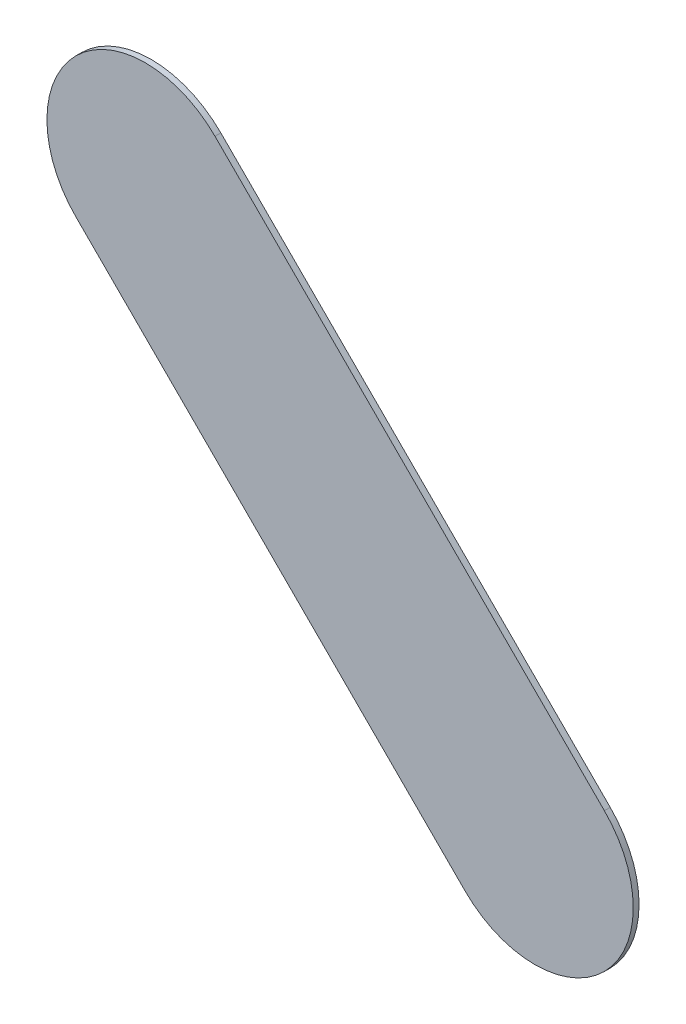
ISO-10303-21;
HEADER;
FILE_DESCRIPTION(('STEP AP214'),'2;1');
FILE_NAME('part.step','',(''),(''),'','','');
FILE_SCHEMA(('AUTOMOTIVE_DESIGN { 1 0 10303 214 1 1 1 1 }'));
ENDSEC;
DATA;
#1=APPLICATION_CONTEXT('core data for automotive mechanical design processes');
#2=APPLICATION_PROTOCOL_DEFINITION('international standard','automotive_design',2000,#1);
#3=PRODUCT_CONTEXT('',#1,'mechanical');
#4=PRODUCT('Part','Part','',(#3));
#5=PRODUCT_RELATED_PRODUCT_CATEGORY('part','',(#4));
#6=PRODUCT_DEFINITION_FORMATION('','',#4);
#7=PRODUCT_DEFINITION_CONTEXT('part definition',#1,'design');
#8=PRODUCT_DEFINITION('design','',#6,#7);
#9=PRODUCT_DEFINITION_SHAPE('','',#8);
#10=(LENGTH_UNIT() NAMED_UNIT(*) SI_UNIT(.MILLI.,.METRE.));
#11=(NAMED_UNIT(*) PLANE_ANGLE_UNIT() SI_UNIT($,.RADIAN.));
#12=(NAMED_UNIT(*) SI_UNIT($,.STERADIAN.) SOLID_ANGLE_UNIT());
#13=UNCERTAINTY_MEASURE_WITH_UNIT(LENGTH_MEASURE(1.E-05),#10,'distance_accuracy_value','');
#14=(GEOMETRIC_REPRESENTATION_CONTEXT(3) GLOBAL_UNCERTAINTY_ASSIGNED_CONTEXT((#13)) GLOBAL_UNIT_ASSIGNED_CONTEXT((#10,
#11,#12)) REPRESENTATION_CONTEXT('',''));
#15=CARTESIAN_POINT('',(0.,0.,0.));
#16=DIRECTION('',(0.,0.,1.));
#17=DIRECTION('',(1.,0.,0.));
#18=AXIS2_PLACEMENT_3D('',#15,#16,#17);
#19=CARTESIAN_POINT('',(49.47576338,120.07572378,0.));
#20=DIRECTION('',(0.707106781186551,0.707106781186544,0.));
#21=DIRECTION('',(0.707106781186544,-0.707106781186551,0.));
#22=AXIS2_PLACEMENT_3D('',#19,#20,#21);
#23=PLANE('',#22);
#24=DIRECTION('',(0.707106781186544,-0.707106781186551,0.));
#25=VECTOR('',#24,1.);
#26=CARTESIAN_POINT('',(49.47576338,120.07572378,0.03556));
#27=LINE('',#26,#25);
#28=CARTESIAN_POINT('',(49.47576338,120.07572378,0.03556));
#29=VERTEX_POINT('',#28);
#30=CARTESIAN_POINT('',(51.84893618,117.70255098,0.03556));
#31=VERTEX_POINT('',#30);
#32=EDGE_CURVE('E11',#29,#31,#27,.T.);
#33=ORIENTED_EDGE('',*,*,#32,.F.);
#34=DIRECTION('',(0.,0.,1.));
#35=VECTOR('',#34,1.);
#36=CARTESIAN_POINT('',(49.47576338,120.07572378,0.));
#37=LINE('',#36,#35);
#38=CARTESIAN_POINT('',(49.47576338,120.07572378,0.));
#39=VERTEX_POINT('',#38);
#40=EDGE_CURVE('E24',#39,#29,#37,.T.);
#41=ORIENTED_EDGE('',*,*,#40,.F.);
#42=DIRECTION('',(0.707106781186544,-0.707106781186551,0.));
#43=VECTOR('',#42,1.);
#44=CARTESIAN_POINT('',(49.47576338,120.07572378,0.));
#45=LINE('',#44,#43);
#46=CARTESIAN_POINT('',(51.84893618,117.70255098,0.));
#47=VERTEX_POINT('',#46);
#48=EDGE_CURVE('E75',#39,#47,#45,.T.);
#49=ORIENTED_EDGE('',*,*,#48,.T.);
#50=DIRECTION('',(0.,0.,1.));
#51=VECTOR('',#50,1.);
#52=CARTESIAN_POINT('',(51.84893618,117.70255098,0.));
#53=LINE('',#52,#51);
#54=EDGE_CURVE('E37',#47,#31,#53,.T.);
#55=ORIENTED_EDGE('',*,*,#54,.T.);
#56=EDGE_LOOP('',(#33,#41,#49,#55));
#57=FACE_BOUND('',#56,.T.);
#58=ADVANCED_FACE('F17',(#57),#23,.F.);
#59=CARTESIAN_POINT('',(52.2732,118.1268148,0.));
#60=DIRECTION('',(0.,0.,-1.));
#61=DIRECTION('',(-0.707106781186542,-0.707106781186554,0.));
#62=AXIS2_PLACEMENT_3D('',#59,#60,#61);
#63=CYLINDRICAL_SURFACE('',#62,0.599999648268223);
#64=CARTESIAN_POINT('',(52.2732,118.1268148,0.03556));
#65=DIRECTION('',(0.,0.,1.));
#66=DIRECTION('',(-0.707106781186542,-0.707106781186554,0.));
#67=AXIS2_PLACEMENT_3D('',#64,#65,#66);
#68=CIRCLE('',#67,0.599999648268223);
#69=CARTESIAN_POINT('',(52.69746382,118.55107862,0.03556));
#70=VERTEX_POINT('',#69);
#71=EDGE_CURVE('E83',#31,#70,#68,.T.);
#72=ORIENTED_EDGE('',*,*,#71,.F.);
#73=ORIENTED_EDGE('',*,*,#54,.F.);
#74=CARTESIAN_POINT('',(52.2732,118.1268148,0.));
#75=DIRECTION('',(0.,0.,1.));
#76=DIRECTION('',(-0.707106781186542,-0.707106781186554,0.));
#77=AXIS2_PLACEMENT_3D('',#74,#75,#76);
#78=CIRCLE('',#77,0.599999648268223);
#79=CARTESIAN_POINT('',(52.69746382,118.55107862,0.));
#80=VERTEX_POINT('',#79);
#81=EDGE_CURVE('E81',#47,#80,#78,.T.);
#82=ORIENTED_EDGE('',*,*,#81,.T.);
#83=DIRECTION('',(0.,0.,1.));
#84=VECTOR('',#83,1.);
#85=CARTESIAN_POINT('',(52.69746382,118.55107862,0.));
#86=LINE('',#85,#84);
#87=EDGE_CURVE('E67',#80,#70,#86,.T.);
#88=ORIENTED_EDGE('',*,*,#87,.T.);
#89=EDGE_LOOP('',(#72,#73,#82,#88));
#90=FACE_BOUND('',#89,.T.);
#91=ADVANCED_FACE('F89',(#90),#63,.T.);
#92=CARTESIAN_POINT('',(52.69746382,118.55107862,0.));
#93=DIRECTION('',(-0.707106781186546,-0.707106781186549,0.));
#94=DIRECTION('',(-0.707106781186549,0.707106781186546,0.));
#95=AXIS2_PLACEMENT_3D('',#92,#93,#94);
#96=PLANE('',#95);
#97=DIRECTION('',(-0.707106781186549,0.707106781186546,0.));
#98=VECTOR('',#97,1.);
#99=CARTESIAN_POINT('',(52.69746382,118.55107862,0.03556));
#100=LINE('',#99,#98);
#101=CARTESIAN_POINT('',(50.32429102,120.92425142,0.03556));
#102=VERTEX_POINT('',#101);
#103=EDGE_CURVE('E71',#70,#102,#100,.T.);
#104=ORIENTED_EDGE('',*,*,#103,.F.);
#105=ORIENTED_EDGE('',*,*,#87,.F.);
#106=DIRECTION('',(-0.707106781186549,0.707106781186546,0.));
#107=VECTOR('',#106,1.);
#108=CARTESIAN_POINT('',(52.69746382,118.55107862,0.));
#109=LINE('',#108,#107);
#110=CARTESIAN_POINT('',(50.32429102,120.92425142,0.));
#111=VERTEX_POINT('',#110);
#112=EDGE_CURVE('E63',#80,#111,#109,.T.);
#113=ORIENTED_EDGE('',*,*,#112,.T.);
#114=DIRECTION('',(0.,0.,1.));
#115=VECTOR('',#114,1.);
#116=CARTESIAN_POINT('',(50.32429102,120.92425142,0.));
#117=LINE('',#116,#115);
#118=EDGE_CURVE('E53',#111,#102,#117,.T.);
#119=ORIENTED_EDGE('',*,*,#118,.T.);
#120=EDGE_LOOP('',(#104,#105,#113,#119));
#121=FACE_BOUND('',#120,.T.);
#122=ADVANCED_FACE('F66',(#121),#96,.F.);
#123=CARTESIAN_POINT('',(49.9000272,120.4999876,0.));
#124=DIRECTION('',(0.,0.,-1.));
#125=DIRECTION('',(0.707106781186554,0.707106781186542,0.));
#126=AXIS2_PLACEMENT_3D('',#123,#124,#125);
#127=CYLINDRICAL_SURFACE('',#126,0.599999648268213);
#128=CARTESIAN_POINT('',(49.9000272,120.4999876,0.03556));
#129=DIRECTION('',(0.,0.,1.));
#130=DIRECTION('',(0.707106781186554,0.707106781186542,0.));
#131=AXIS2_PLACEMENT_3D('',#128,#129,#130);
#132=CIRCLE('',#131,0.599999648268213);
#133=EDGE_CURVE('E59',#102,#29,#132,.T.);
#134=ORIENTED_EDGE('',*,*,#133,.F.);
#135=ORIENTED_EDGE('',*,*,#118,.F.);
#136=CARTESIAN_POINT('',(49.9000272,120.4999876,0.));
#137=DIRECTION('',(0.,0.,1.));
#138=DIRECTION('',(0.707106781186554,0.707106781186542,0.));
#139=AXIS2_PLACEMENT_3D('',#136,#137,#138);
#140=CIRCLE('',#139,0.599999648268213);
#141=EDGE_CURVE('E57',#111,#39,#140,.T.);
#142=ORIENTED_EDGE('',*,*,#141,.T.);
#143=ORIENTED_EDGE('',*,*,#40,.T.);
#144=EDGE_LOOP('',(#134,#135,#142,#143));
#145=FACE_BOUND('',#144,.T.);
#146=ADVANCED_FACE('F55',(#145),#127,.T.);
#147=CARTESIAN_POINT('',(49.47576338,120.07572378,0.));
#148=DIRECTION('',(0.,0.,-1.));
#149=DIRECTION('',(-1.,0.,0.));
#150=AXIS2_PLACEMENT_3D('',#147,#148,#149);
#151=PLANE('',#150);
#152=ORIENTED_EDGE('',*,*,#141,.F.);
#153=ORIENTED_EDGE('',*,*,#112,.F.);
#154=ORIENTED_EDGE('',*,*,#81,.F.);
#155=ORIENTED_EDGE('',*,*,#48,.F.);
#156=EDGE_LOOP('',(#152,#153,#154,#155));
#157=FACE_BOUND('',#156,.T.);
#158=ADVANCED_FACE('F74',(#157),#151,.T.);
#159=CARTESIAN_POINT('',(49.47576338,120.07572378,0.03556));
#160=DIRECTION('',(0.,0.,-1.));
#161=DIRECTION('',(-1.,0.,0.));
#162=AXIS2_PLACEMENT_3D('',#159,#160,#161);
#163=PLANE('',#162);
#164=ORIENTED_EDGE('',*,*,#32,.T.);
#165=ORIENTED_EDGE('',*,*,#71,.T.);
#166=ORIENTED_EDGE('',*,*,#103,.T.);
#167=ORIENTED_EDGE('',*,*,#133,.T.);
#168=EDGE_LOOP('',(#164,#165,#166,#167));
#169=FACE_BOUND('',#168,.T.);
#170=ADVANCED_FACE('F91',(#169),#163,.F.);
#171=CLOSED_SHELL('',(#58,#91,#122,#146,#158,#170));
#172=MANIFOLD_SOLID_BREP('B1',#171);
#173=ADVANCED_BREP_SHAPE_REPRESENTATION('',(#18,#172),#14);
#174=SHAPE_DEFINITION_REPRESENTATION(#9,#173);
ENDSEC;
END-ISO-10303-21;
